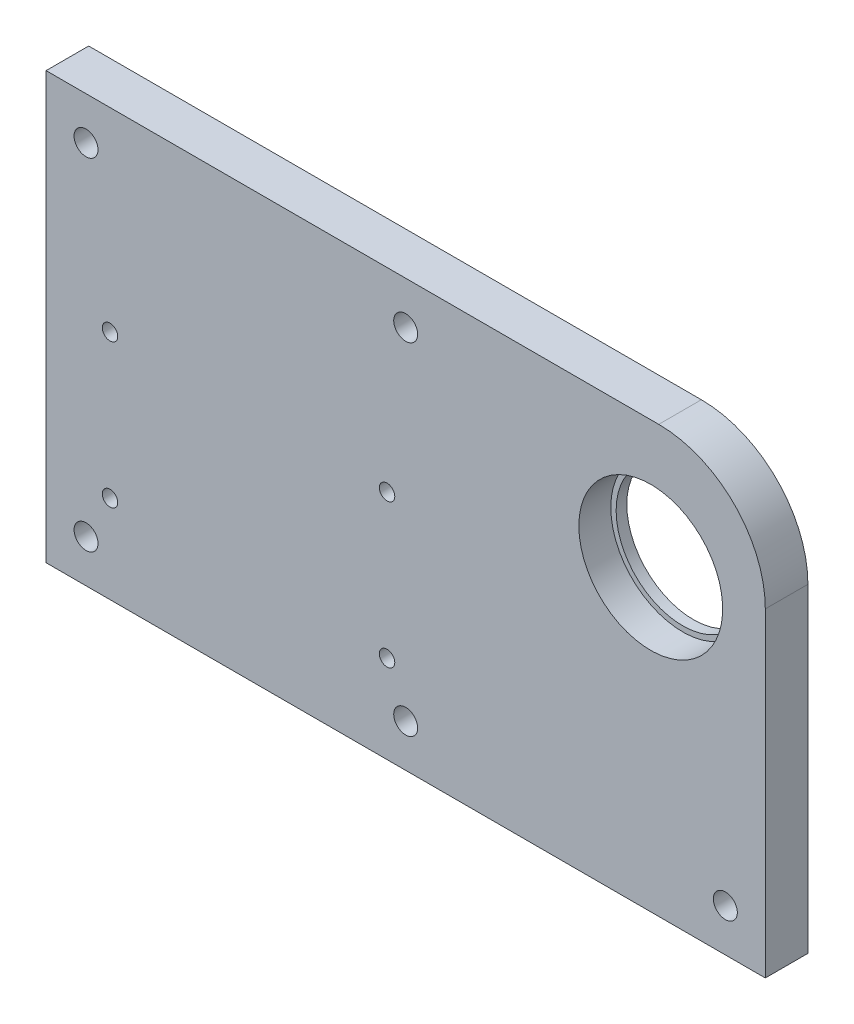
ISO-10303-21;
HEADER;
FILE_DESCRIPTION(('STEP AP214'),'2;1');
FILE_NAME('part.step','',(''),(''),'','','');
FILE_SCHEMA(('AUTOMOTIVE_DESIGN { 1 0 10303 214 1 1 1 1 }'));
ENDSEC;
DATA;
#1=APPLICATION_CONTEXT('core data for automotive mechanical design processes');
#2=APPLICATION_PROTOCOL_DEFINITION('international standard','automotive_design',2000,#1);
#3=PRODUCT_CONTEXT('',#1,'mechanical');
#4=PRODUCT('Part','Part','',(#3));
#5=PRODUCT_RELATED_PRODUCT_CATEGORY('part','',(#4));
#6=PRODUCT_DEFINITION_FORMATION('','',#4);
#7=PRODUCT_DEFINITION_CONTEXT('part definition',#1,'design');
#8=PRODUCT_DEFINITION('design','',#6,#7);
#9=PRODUCT_DEFINITION_SHAPE('','',#8);
#10=(LENGTH_UNIT() NAMED_UNIT(*) SI_UNIT(.MILLI.,.METRE.));
#11=(NAMED_UNIT(*) PLANE_ANGLE_UNIT() SI_UNIT($,.RADIAN.));
#12=(NAMED_UNIT(*) SI_UNIT($,.STERADIAN.) SOLID_ANGLE_UNIT());
#13=UNCERTAINTY_MEASURE_WITH_UNIT(LENGTH_MEASURE(1.E-05),#10,'distance_accuracy_value','');
#14=(GEOMETRIC_REPRESENTATION_CONTEXT(3) GLOBAL_UNCERTAINTY_ASSIGNED_CONTEXT((#13)) GLOBAL_UNIT_ASSIGNED_CONTEXT((#10,
#11,#12)) REPRESENTATION_CONTEXT('',''));
#15=CARTESIAN_POINT('',(0.,0.,0.));
#16=DIRECTION('',(0.,0.,1.));
#17=DIRECTION('',(1.,0.,0.));
#18=AXIS2_PLACEMENT_3D('',#15,#16,#17);
#19=CARTESIAN_POINT('',(-53.5,50.,8.));
#20=DIRECTION('',(1.,0.,0.));
#21=DIRECTION('',(0.,1.,0.));
#22=AXIS2_PLACEMENT_3D('',#19,#20,#21);
#23=PLANE('',#22);
#24=DIRECTION('',(0.,-1.,0.));
#25=VECTOR('',#24,1.);
#26=CARTESIAN_POINT('',(-53.5,50.,0.));
#27=LINE('',#26,#25);
#28=CARTESIAN_POINT('',(-53.5,50.,0.));
#29=VERTEX_POINT('',#28);
#30=CARTESIAN_POINT('',(-53.5,-30.,0.));
#31=VERTEX_POINT('',#30);
#32=EDGE_CURVE('E112',#29,#31,#27,.T.);
#33=ORIENTED_EDGE('',*,*,#32,.T.);
#34=DIRECTION('',(0.,0.,-1.));
#35=VECTOR('',#34,1.);
#36=CARTESIAN_POINT('',(-53.5,-30.,8.));
#37=LINE('',#36,#35);
#38=CARTESIAN_POINT('',(-53.5,-30.,8.));
#39=VERTEX_POINT('',#38);
#40=EDGE_CURVE('E92',#39,#31,#37,.T.);
#41=ORIENTED_EDGE('',*,*,#40,.F.);
#42=DIRECTION('',(0.,-1.,0.));
#43=VECTOR('',#42,1.);
#44=CARTESIAN_POINT('',(-53.5,50.,8.));
#45=LINE('',#44,#43);
#46=CARTESIAN_POINT('',(-53.5,50.,8.));
#47=VERTEX_POINT('',#46);
#48=EDGE_CURVE('E99',#47,#39,#45,.T.);
#49=ORIENTED_EDGE('',*,*,#48,.F.);
#50=DIRECTION('',(0.,0.,-1.));
#51=VECTOR('',#50,1.);
#52=CARTESIAN_POINT('',(-53.5,50.,8.));
#53=LINE('',#52,#51);
#54=EDGE_CURVE('E120',#47,#29,#53,.T.);
#55=ORIENTED_EDGE('',*,*,#54,.T.);
#56=EDGE_LOOP('',(#33,#41,#49,#55));
#57=FACE_BOUND('',#56,.T.);
#58=ADVANCED_FACE('F40',(#57),#23,.F.);
#59=CARTESIAN_POINT('',(-53.5,-30.,8.));
#60=DIRECTION('',(0.,1.,0.));
#61=DIRECTION('',(-1.,0.,0.));
#62=AXIS2_PLACEMENT_3D('',#59,#60,#61);
#63=PLANE('',#62);
#64=DIRECTION('',(1.,0.,0.));
#65=VECTOR('',#64,1.);
#66=CARTESIAN_POINT('',(-53.5,-30.,0.));
#67=LINE('',#66,#65);
#68=CARTESIAN_POINT('',(81.5,-30.,0.));
#69=VERTEX_POINT('',#68);
#70=EDGE_CURVE('E133',#31,#69,#67,.T.);
#71=ORIENTED_EDGE('',*,*,#70,.T.);
#72=DIRECTION('',(0.,0.,-1.));
#73=VECTOR('',#72,1.);
#74=CARTESIAN_POINT('',(81.5,-30.,8.));
#75=LINE('',#74,#73);
#76=CARTESIAN_POINT('',(81.5,-30.,8.));
#77=VERTEX_POINT('',#76);
#78=EDGE_CURVE('E95',#77,#69,#75,.T.);
#79=ORIENTED_EDGE('',*,*,#78,.F.);
#80=DIRECTION('',(1.,0.,0.));
#81=VECTOR('',#80,1.);
#82=CARTESIAN_POINT('',(-53.5,-30.,8.));
#83=LINE('',#82,#81);
#84=EDGE_CURVE('E88',#39,#77,#83,.T.);
#85=ORIENTED_EDGE('',*,*,#84,.F.);
#86=ORIENTED_EDGE('',*,*,#40,.T.);
#87=EDGE_LOOP('',(#71,#79,#85,#86));
#88=FACE_BOUND('',#87,.T.);
#89=ADVANCED_FACE('F90',(#88),#63,.F.);
#90=CARTESIAN_POINT('',(81.5,50.,8.));
#91=DIRECTION('',(-1.,0.,0.));
#92=DIRECTION('',(0.,-1.,0.));
#93=AXIS2_PLACEMENT_3D('',#90,#91,#92);
#94=PLANE('',#93);
#95=DIRECTION('',(0.,1.,0.));
#96=VECTOR('',#95,1.);
#97=CARTESIAN_POINT('',(81.5,50.,0.));
#98=LINE('',#97,#96);
#99=CARTESIAN_POINT('',(81.5,30.,0.));
#100=VERTEX_POINT('',#99);
#101=EDGE_CURVE('E130',#69,#100,#98,.T.);
#102=ORIENTED_EDGE('',*,*,#101,.T.);
#103=DIRECTION('',(0.,0.,-1.));
#104=VECTOR('',#103,1.);
#105=CARTESIAN_POINT('',(81.5,30.,8.));
#106=LINE('',#105,#104);
#107=CARTESIAN_POINT('',(81.5,30.,8.));
#108=VERTEX_POINT('',#107);
#109=EDGE_CURVE('E49',#100,#108,#106,.F.);
#110=ORIENTED_EDGE('',*,*,#109,.T.);
#111=DIRECTION('',(0.,1.,0.));
#112=VECTOR('',#111,1.);
#113=CARTESIAN_POINT('',(81.5,50.,8.));
#114=LINE('',#113,#112);
#115=EDGE_CURVE('E98',#77,#108,#114,.T.);
#116=ORIENTED_EDGE('',*,*,#115,.F.);
#117=ORIENTED_EDGE('',*,*,#78,.T.);
#118=EDGE_LOOP('',(#102,#110,#116,#117));
#119=FACE_BOUND('',#118,.T.);
#120=ADVANCED_FACE('F368',(#119),#94,.F.);
#121=CARTESIAN_POINT('',(-53.5,50.,8.));
#122=DIRECTION('',(0.,-1.,0.));
#123=DIRECTION('',(0.,0.,-1.));
#124=AXIS2_PLACEMENT_3D('',#121,#122,#123);
#125=PLANE('',#124);
#126=DIRECTION('',(-1.,0.,0.));
#127=VECTOR('',#126,1.);
#128=CARTESIAN_POINT('',(-53.5,50.,8.));
#129=LINE('',#128,#127);
#130=CARTESIAN_POINT('',(61.5,50.,8.));
#131=VERTEX_POINT('',#130);
#132=EDGE_CURVE('E104',#131,#47,#129,.T.);
#133=ORIENTED_EDGE('',*,*,#132,.F.);
#134=DIRECTION('',(0.,0.,-1.));
#135=VECTOR('',#134,1.);
#136=CARTESIAN_POINT('',(61.5,50.,8.));
#137=LINE('',#136,#135);
#138=CARTESIAN_POINT('',(61.5,50.,0.));
#139=VERTEX_POINT('',#138);
#140=EDGE_CURVE('E114',#131,#139,#137,.T.);
#141=ORIENTED_EDGE('',*,*,#140,.T.);
#142=DIRECTION('',(-1.,0.,0.));
#143=VECTOR('',#142,1.);
#144=CARTESIAN_POINT('',(-53.5,50.,0.));
#145=LINE('',#144,#143);
#146=EDGE_CURVE('E109',#139,#29,#145,.T.);
#147=ORIENTED_EDGE('',*,*,#146,.T.);
#148=ORIENTED_EDGE('',*,*,#54,.F.);
#149=EDGE_LOOP('',(#133,#141,#147,#148));
#150=FACE_BOUND('',#149,.T.);
#151=ADVANCED_FACE('F364',(#150),#125,.F.);
#152=CARTESIAN_POINT('',(0.,0.,8.));
#153=DIRECTION('',(0.,0.,1.));
#154=DIRECTION('',(1.,0.,0.));
#155=AXIS2_PLACEMENT_3D('',#152,#153,#154);
#156=PLANE('',#155);
#157=CARTESIAN_POINT('',(-46.,-22.,8.));
#158=DIRECTION('',(0.,0.,-1.));
#159=DIRECTION('',(-1.,0.,0.));
#160=AXIS2_PLACEMENT_3D('',#157,#158,#159);
#161=CIRCLE('',#160,2.25);
#162=CARTESIAN_POINT('',(-48.25,-22.,8.));
#163=VERTEX_POINT('',#162);
#164=EDGE_CURVE('E318',#163,#163,#161,.T.);
#165=ORIENTED_EDGE('',*,*,#164,.T.);
#166=EDGE_LOOP('',(#165));
#167=FACE_BOUND('',#166,.T.);
#168=CARTESIAN_POINT('',(14.,-22.,8.));
#169=DIRECTION('',(0.,0.,-1.));
#170=DIRECTION('',(-1.,0.,0.));
#171=AXIS2_PLACEMENT_3D('',#168,#169,#170);
#172=CIRCLE('',#171,2.25000000000001);
#173=CARTESIAN_POINT('',(11.75,-22.,8.));
#174=VERTEX_POINT('',#173);
#175=EDGE_CURVE('E298',#174,#174,#172,.T.);
#176=ORIENTED_EDGE('',*,*,#175,.T.);
#177=EDGE_LOOP('',(#176));
#178=FACE_BOUND('',#177,.T.);
#179=CARTESIAN_POINT('',(74.,-22.,8.));
#180=DIRECTION('',(0.,0.,-1.));
#181=DIRECTION('',(-1.,0.,0.));
#182=AXIS2_PLACEMENT_3D('',#179,#180,#181);
#183=CIRCLE('',#182,2.25);
#184=CARTESIAN_POINT('',(71.75,-22.,8.));
#185=VERTEX_POINT('',#184);
#186=EDGE_CURVE('E278',#185,#185,#183,.T.);
#187=ORIENTED_EDGE('',*,*,#186,.T.);
#188=EDGE_LOOP('',(#187));
#189=FACE_BOUND('',#188,.T.);
#190=CARTESIAN_POINT('',(-46.,42.,8.));
#191=DIRECTION('',(0.,0.,-1.));
#192=DIRECTION('',(-1.,0.,0.));
#193=AXIS2_PLACEMENT_3D('',#190,#191,#192);
#194=CIRCLE('',#193,2.25);
#195=CARTESIAN_POINT('',(-48.25,42.,8.));
#196=VERTEX_POINT('',#195);
#197=EDGE_CURVE('E258',#196,#196,#194,.T.);
#198=ORIENTED_EDGE('',*,*,#197,.T.);
#199=EDGE_LOOP('',(#198));
#200=FACE_BOUND('',#199,.T.);
#201=CARTESIAN_POINT('',(14.,42.,8.));
#202=DIRECTION('',(0.,0.,-1.));
#203=DIRECTION('',(-1.,0.,0.));
#204=AXIS2_PLACEMENT_3D('',#201,#202,#203);
#205=CIRCLE('',#204,2.25000000000001);
#206=CARTESIAN_POINT('',(11.75,42.,8.));
#207=VERTEX_POINT('',#206);
#208=EDGE_CURVE('E238',#207,#207,#205,.T.);
#209=ORIENTED_EDGE('',*,*,#208,.T.);
#210=EDGE_LOOP('',(#209));
#211=FACE_BOUND('',#210,.T.);
#212=CARTESIAN_POINT('',(60.,26.,8.));
#213=DIRECTION('',(0.,0.,-1.));
#214=DIRECTION('',(-1.,0.,0.));
#215=AXIS2_PLACEMENT_3D('',#212,#213,#214);
#216=CIRCLE('',#215,13.5);
#217=CARTESIAN_POINT('',(46.5,26.,8.));
#218=VERTEX_POINT('',#217);
#219=EDGE_CURVE('E226',#218,#218,#216,.T.);
#220=ORIENTED_EDGE('',*,*,#219,.T.);
#221=EDGE_LOOP('',(#220));
#222=FACE_BOUND('',#221,.T.);
#223=CARTESIAN_POINT('',(10.5,13.5,8.));
#224=DIRECTION('',(0.,0.,-1.));
#225=DIRECTION('',(-1.,0.,0.));
#226=AXIS2_PLACEMENT_3D('',#223,#224,#225);
#227=CIRCLE('',#226,1.45);
#228=CARTESIAN_POINT('',(9.05,13.5,8.));
#229=VERTEX_POINT('',#228);
#230=EDGE_CURVE('E202',#229,#229,#227,.T.);
#231=ORIENTED_EDGE('',*,*,#230,.T.);
#232=EDGE_LOOP('',(#231));
#233=FACE_BOUND('',#232,.T.);
#234=CARTESIAN_POINT('',(10.5,-13.5,8.));
#235=DIRECTION('',(0.,0.,-1.));
#236=DIRECTION('',(-1.,0.,0.));
#237=AXIS2_PLACEMENT_3D('',#234,#235,#236);
#238=CIRCLE('',#237,1.45);
#239=CARTESIAN_POINT('',(9.05,-13.5,8.));
#240=VERTEX_POINT('',#239);
#241=EDGE_CURVE('E182',#240,#240,#238,.T.);
#242=ORIENTED_EDGE('',*,*,#241,.T.);
#243=EDGE_LOOP('',(#242));
#244=FACE_BOUND('',#243,.T.);
#245=CARTESIAN_POINT('',(-41.5,-13.5,8.));
#246=DIRECTION('',(0.,0.,-1.));
#247=DIRECTION('',(-1.,0.,0.));
#248=AXIS2_PLACEMENT_3D('',#245,#246,#247);
#249=CIRCLE('',#248,1.45);
#250=CARTESIAN_POINT('',(-42.95,-13.5,8.));
#251=VERTEX_POINT('',#250);
#252=EDGE_CURVE('E162',#251,#251,#249,.T.);
#253=ORIENTED_EDGE('',*,*,#252,.T.);
#254=EDGE_LOOP('',(#253));
#255=FACE_BOUND('',#254,.T.);
#256=CARTESIAN_POINT('',(-41.5,13.5,8.));
#257=DIRECTION('',(0.,0.,-1.));
#258=DIRECTION('',(-1.,0.,0.));
#259=AXIS2_PLACEMENT_3D('',#256,#257,#258);
#260=CIRCLE('',#259,1.45);
#261=CARTESIAN_POINT('',(-42.95,13.5,8.));
#262=VERTEX_POINT('',#261);
#263=EDGE_CURVE('E138',#262,#262,#260,.T.);
#264=ORIENTED_EDGE('',*,*,#263,.T.);
#265=EDGE_LOOP('',(#264));
#266=FACE_BOUND('',#265,.T.);
#267=ORIENTED_EDGE('',*,*,#115,.T.);
#268=CARTESIAN_POINT('',(61.5,30.,8.));
#269=DIRECTION('',(0.,0.,1.));
#270=DIRECTION('',(1.,0.,0.));
#271=AXIS2_PLACEMENT_3D('',#268,#269,#270);
#272=CIRCLE('',#271,20.);
#273=EDGE_CURVE('E11',#108,#131,#272,.T.);
#274=ORIENTED_EDGE('',*,*,#273,.T.);
#275=ORIENTED_EDGE('',*,*,#132,.T.);
#276=ORIENTED_EDGE('',*,*,#48,.T.);
#277=ORIENTED_EDGE('',*,*,#84,.T.);
#278=EDGE_LOOP('',(#267,#274,#275,#276,#277));
#279=FACE_BOUND('',#278,.T.);
#280=ADVANCED_FACE('F102',(#167,#178,#189,#200,#211,#222,#233,#244,#255,#266,#279),#156,.T.);
#281=CARTESIAN_POINT('',(0.,0.,0.));
#282=DIRECTION('',(0.,0.,1.));
#283=DIRECTION('',(1.,0.,0.));
#284=AXIS2_PLACEMENT_3D('',#281,#282,#283);
#285=PLANE('',#284);
#286=CARTESIAN_POINT('',(-46.,-22.,0.));
#287=DIRECTION('',(0.,0.,-1.));
#288=DIRECTION('',(-1.,0.,0.));
#289=AXIS2_PLACEMENT_3D('',#286,#287,#288);
#290=CIRCLE('',#289,4.025);
#291=CARTESIAN_POINT('',(-50.025,-22.,0.));
#292=VERTEX_POINT('',#291);
#293=EDGE_CURVE('E334',#292,#292,#290,.T.);
#294=ORIENTED_EDGE('',*,*,#293,.F.);
#295=EDGE_LOOP('',(#294));
#296=FACE_BOUND('',#295,.T.);
#297=CARTESIAN_POINT('',(14.,-22.,0.));
#298=DIRECTION('',(0.,0.,-1.));
#299=DIRECTION('',(-1.,0.,0.));
#300=AXIS2_PLACEMENT_3D('',#297,#298,#299);
#301=CIRCLE('',#300,4.025);
#302=CARTESIAN_POINT('',(9.97500000000001,-22.,0.));
#303=VERTEX_POINT('',#302);
#304=EDGE_CURVE('E314',#303,#303,#301,.T.);
#305=ORIENTED_EDGE('',*,*,#304,.F.);
#306=EDGE_LOOP('',(#305));
#307=FACE_BOUND('',#306,.T.);
#308=CARTESIAN_POINT('',(74.,-22.,0.));
#309=DIRECTION('',(0.,0.,-1.));
#310=DIRECTION('',(-1.,0.,0.));
#311=AXIS2_PLACEMENT_3D('',#308,#309,#310);
#312=CIRCLE('',#311,4.025);
#313=CARTESIAN_POINT('',(69.975,-22.,0.));
#314=VERTEX_POINT('',#313);
#315=EDGE_CURVE('E294',#314,#314,#312,.T.);
#316=ORIENTED_EDGE('',*,*,#315,.F.);
#317=EDGE_LOOP('',(#316));
#318=FACE_BOUND('',#317,.T.);
#319=CARTESIAN_POINT('',(-46.,42.,0.));
#320=DIRECTION('',(0.,0.,-1.));
#321=DIRECTION('',(-1.,0.,0.));
#322=AXIS2_PLACEMENT_3D('',#319,#320,#321);
#323=CIRCLE('',#322,4.025);
#324=CARTESIAN_POINT('',(-50.025,42.,0.));
#325=VERTEX_POINT('',#324);
#326=EDGE_CURVE('E274',#325,#325,#323,.T.);
#327=ORIENTED_EDGE('',*,*,#326,.F.);
#328=EDGE_LOOP('',(#327));
#329=FACE_BOUND('',#328,.T.);
#330=CARTESIAN_POINT('',(14.,42.,0.));
#331=DIRECTION('',(0.,0.,-1.));
#332=DIRECTION('',(-1.,0.,0.));
#333=AXIS2_PLACEMENT_3D('',#330,#331,#332);
#334=CIRCLE('',#333,4.025);
#335=CARTESIAN_POINT('',(9.975,42.,0.));
#336=VERTEX_POINT('',#335);
#337=EDGE_CURVE('E254',#336,#336,#334,.T.);
#338=ORIENTED_EDGE('',*,*,#337,.F.);
#339=EDGE_LOOP('',(#338));
#340=FACE_BOUND('',#339,.T.);
#341=CARTESIAN_POINT('',(60.,26.,0.));
#342=DIRECTION('',(0.,0.,-1.));
#343=DIRECTION('',(-1.,0.,0.));
#344=AXIS2_PLACEMENT_3D('',#341,#342,#343);
#345=CIRCLE('',#344,12.5);
#346=CARTESIAN_POINT('',(47.5,26.,0.));
#347=VERTEX_POINT('',#346);
#348=EDGE_CURVE('E230',#347,#347,#345,.T.);
#349=ORIENTED_EDGE('',*,*,#348,.F.);
#350=EDGE_LOOP('',(#349));
#351=FACE_BOUND('',#350,.T.);
#352=CARTESIAN_POINT('',(10.5,13.5,0.));
#353=DIRECTION('',(0.,0.,-1.));
#354=DIRECTION('',(-1.,0.,0.));
#355=AXIS2_PLACEMENT_3D('',#352,#353,#354);
#356=CIRCLE('',#355,2.775);
#357=CARTESIAN_POINT('',(7.725,13.5,0.));
#358=VERTEX_POINT('',#357);
#359=EDGE_CURVE('E218',#358,#358,#356,.T.);
#360=ORIENTED_EDGE('',*,*,#359,.F.);
#361=EDGE_LOOP('',(#360));
#362=FACE_BOUND('',#361,.T.);
#363=CARTESIAN_POINT('',(10.5,-13.5,0.));
#364=DIRECTION('',(0.,0.,-1.));
#365=DIRECTION('',(-1.,0.,0.));
#366=AXIS2_PLACEMENT_3D('',#363,#364,#365);
#367=CIRCLE('',#366,2.775);
#368=CARTESIAN_POINT('',(7.725,-13.5,0.));
#369=VERTEX_POINT('',#368);
#370=EDGE_CURVE('E198',#369,#369,#367,.T.);
#371=ORIENTED_EDGE('',*,*,#370,.F.);
#372=EDGE_LOOP('',(#371));
#373=FACE_BOUND('',#372,.T.);
#374=CARTESIAN_POINT('',(-41.5,-13.5,0.));
#375=DIRECTION('',(0.,0.,-1.));
#376=DIRECTION('',(-1.,0.,0.));
#377=AXIS2_PLACEMENT_3D('',#374,#375,#376);
#378=CIRCLE('',#377,2.775);
#379=CARTESIAN_POINT('',(-44.275,-13.5,0.));
#380=VERTEX_POINT('',#379);
#381=EDGE_CURVE('E178',#380,#380,#378,.T.);
#382=ORIENTED_EDGE('',*,*,#381,.F.);
#383=EDGE_LOOP('',(#382));
#384=FACE_BOUND('',#383,.T.);
#385=CARTESIAN_POINT('',(-41.5,13.5,0.));
#386=DIRECTION('',(0.,0.,-1.));
#387=DIRECTION('',(-1.,0.,0.));
#388=AXIS2_PLACEMENT_3D('',#385,#386,#387);
#389=CIRCLE('',#388,2.775);
#390=CARTESIAN_POINT('',(-44.275,13.5,0.));
#391=VERTEX_POINT('',#390);
#392=EDGE_CURVE('E158',#391,#391,#389,.T.);
#393=ORIENTED_EDGE('',*,*,#392,.F.);
#394=EDGE_LOOP('',(#393));
#395=FACE_BOUND('',#394,.T.);
#396=ORIENTED_EDGE('',*,*,#146,.F.);
#397=CARTESIAN_POINT('',(61.5,30.,0.));
#398=DIRECTION('',(0.,0.,1.));
#399=DIRECTION('',(1.,0.,0.));
#400=AXIS2_PLACEMENT_3D('',#397,#398,#399);
#401=CIRCLE('',#400,20.);
#402=EDGE_CURVE('E63',#139,#100,#401,.F.);
#403=ORIENTED_EDGE('',*,*,#402,.T.);
#404=ORIENTED_EDGE('',*,*,#101,.F.);
#405=ORIENTED_EDGE('',*,*,#70,.F.);
#406=ORIENTED_EDGE('',*,*,#32,.F.);
#407=EDGE_LOOP('',(#396,#403,#404,#405,#406));
#408=FACE_BOUND('',#407,.T.);
#409=ADVANCED_FACE('F341',(#296,#307,#318,#329,#340,#351,#362,#373,#384,#395,#408),#285,.F.);
#410=CARTESIAN_POINT('',(-41.5,13.5,0.));
#411=DIRECTION('',(0.,0.,-1.));
#412=DIRECTION('',(-1.,0.,0.));
#413=AXIS2_PLACEMENT_3D('',#410,#411,#412);
#414=CYLINDRICAL_SURFACE('',#413,1.45000000000001);
#415=ORIENTED_EDGE('',*,*,#263,.F.);
#416=EDGE_LOOP('',(#415));
#417=FACE_BOUND('',#416,.T.);
#418=CARTESIAN_POINT('',(-41.5,13.5,2.5));
#419=DIRECTION('',(0.,0.,-1.));
#420=DIRECTION('',(-1.,0.,0.));
#421=AXIS2_PLACEMENT_3D('',#418,#419,#420);
#422=CIRCLE('',#421,1.45000000000001);
#423=CARTESIAN_POINT('',(-42.95,13.5,2.5));
#424=VERTEX_POINT('',#423);
#425=EDGE_CURVE('E146',#424,#424,#422,.T.);
#426=ORIENTED_EDGE('',*,*,#425,.T.);
#427=EDGE_LOOP('',(#426));
#428=FACE_BOUND('',#427,.T.);
#429=ADVANCED_FACE('F344',(#417,#428),#414,.F.);
#430=CARTESIAN_POINT('',(-38.75,13.5,2.5));
#431=DIRECTION('',(0.,0.,1.));
#432=DIRECTION('',(1.,0.,0.));
#433=AXIS2_PLACEMENT_3D('',#430,#431,#432);
#434=PLANE('',#433);
#435=ORIENTED_EDGE('',*,*,#425,.F.);
#436=EDGE_LOOP('',(#435));
#437=FACE_BOUND('',#436,.T.);
#438=CARTESIAN_POINT('',(-41.5,13.5,2.5));
#439=DIRECTION('',(0.,0.,-1.));
#440=DIRECTION('',(-1.,0.,0.));
#441=AXIS2_PLACEMENT_3D('',#438,#439,#440);
#442=CIRCLE('',#441,2.75);
#443=CARTESIAN_POINT('',(-44.25,13.5,2.5));
#444=VERTEX_POINT('',#443);
#445=EDGE_CURVE('E150',#444,#444,#442,.T.);
#446=ORIENTED_EDGE('',*,*,#445,.T.);
#447=EDGE_LOOP('',(#446));
#448=FACE_BOUND('',#447,.T.);
#449=ADVANCED_FACE('F394',(#437,#448),#434,.F.);
#450=CARTESIAN_POINT('',(-41.5,13.5,0.));
#451=DIRECTION('',(0.,0.,-1.));
#452=DIRECTION('',(-1.,0.,0.));
#453=AXIS2_PLACEMENT_3D('',#450,#451,#452);
#454=CYLINDRICAL_SURFACE('',#453,2.75);
#455=ORIENTED_EDGE('',*,*,#445,.F.);
#456=EDGE_LOOP('',(#455));
#457=FACE_BOUND('',#456,.T.);
#458=CARTESIAN_POINT('',(-41.5,13.5,0.0250000000000012));
#459=DIRECTION('',(0.,0.,-1.));
#460=DIRECTION('',(-1.,0.,0.));
#461=AXIS2_PLACEMENT_3D('',#458,#459,#460);
#462=CIRCLE('',#461,2.75);
#463=CARTESIAN_POINT('',(-44.25,13.5,0.0250000000000012));
#464=VERTEX_POINT('',#463);
#465=EDGE_CURVE('E154',#464,#464,#462,.T.);
#466=ORIENTED_EDGE('',*,*,#465,.T.);
#467=EDGE_LOOP('',(#466));
#468=FACE_BOUND('',#467,.T.);
#469=ADVANCED_FACE('F405',(#457,#468),#454,.F.);
#470=CARTESIAN_POINT('',(-41.5,13.5,0.));
#471=DIRECTION('',(0.,0.,-1.));
#472=DIRECTION('',(-1.,0.,0.));
#473=AXIS2_PLACEMENT_3D('',#470,#471,#472);
#474=CONICAL_SURFACE('',#473,2.775,0.7853981633973);
#475=ORIENTED_EDGE('',*,*,#465,.F.);
#476=EDGE_LOOP('',(#475));
#477=FACE_BOUND('',#476,.T.);
#478=ORIENTED_EDGE('',*,*,#392,.T.);
#479=EDGE_LOOP('',(#478));
#480=FACE_BOUND('',#479,.T.);
#481=ADVANCED_FACE('F415',(#477,#480),#474,.F.);
#482=CARTESIAN_POINT('',(-41.5,-13.5,0.));
#483=DIRECTION('',(0.,0.,-1.));
#484=DIRECTION('',(-1.,0.,0.));
#485=AXIS2_PLACEMENT_3D('',#482,#483,#484);
#486=CYLINDRICAL_SURFACE('',#485,1.45000000000001);
#487=ORIENTED_EDGE('',*,*,#252,.F.);
#488=EDGE_LOOP('',(#487));
#489=FACE_BOUND('',#488,.T.);
#490=CARTESIAN_POINT('',(-41.5,-13.5,2.5));
#491=DIRECTION('',(0.,0.,-1.));
#492=DIRECTION('',(-1.,0.,0.));
#493=AXIS2_PLACEMENT_3D('',#490,#491,#492);
#494=CIRCLE('',#493,1.45000000000001);
#495=CARTESIAN_POINT('',(-42.95,-13.5,2.5));
#496=VERTEX_POINT('',#495);
#497=EDGE_CURVE('E166',#496,#496,#494,.T.);
#498=ORIENTED_EDGE('',*,*,#497,.T.);
#499=EDGE_LOOP('',(#498));
#500=FACE_BOUND('',#499,.T.);
#501=ADVANCED_FACE('F425',(#489,#500),#486,.F.);
#502=CARTESIAN_POINT('',(-38.75,-13.5,2.5));
#503=DIRECTION('',(0.,0.,1.));
#504=DIRECTION('',(1.,0.,0.));
#505=AXIS2_PLACEMENT_3D('',#502,#503,#504);
#506=PLANE('',#505);
#507=ORIENTED_EDGE('',*,*,#497,.F.);
#508=EDGE_LOOP('',(#507));
#509=FACE_BOUND('',#508,.T.);
#510=CARTESIAN_POINT('',(-41.5,-13.5,2.5));
#511=DIRECTION('',(0.,0.,-1.));
#512=DIRECTION('',(-1.,0.,0.));
#513=AXIS2_PLACEMENT_3D('',#510,#511,#512);
#514=CIRCLE('',#513,2.75);
#515=CARTESIAN_POINT('',(-44.25,-13.5,2.5));
#516=VERTEX_POINT('',#515);
#517=EDGE_CURVE('E170',#516,#516,#514,.T.);
#518=ORIENTED_EDGE('',*,*,#517,.T.);
#519=EDGE_LOOP('',(#518));
#520=FACE_BOUND('',#519,.T.);
#521=ADVANCED_FACE('F435',(#509,#520),#506,.F.);
#522=CARTESIAN_POINT('',(-41.5,-13.5,0.));
#523=DIRECTION('',(0.,0.,-1.));
#524=DIRECTION('',(-1.,0.,0.));
#525=AXIS2_PLACEMENT_3D('',#522,#523,#524);
#526=CYLINDRICAL_SURFACE('',#525,2.75);
#527=ORIENTED_EDGE('',*,*,#517,.F.);
#528=EDGE_LOOP('',(#527));
#529=FACE_BOUND('',#528,.T.);
#530=CARTESIAN_POINT('',(-41.5,-13.5,0.0250000000000012));
#531=DIRECTION('',(0.,0.,-1.));
#532=DIRECTION('',(-1.,0.,0.));
#533=AXIS2_PLACEMENT_3D('',#530,#531,#532);
#534=CIRCLE('',#533,2.75);
#535=CARTESIAN_POINT('',(-44.25,-13.5,0.0250000000000012));
#536=VERTEX_POINT('',#535);
#537=EDGE_CURVE('E174',#536,#536,#534,.T.);
#538=ORIENTED_EDGE('',*,*,#537,.T.);
#539=EDGE_LOOP('',(#538));
#540=FACE_BOUND('',#539,.T.);
#541=ADVANCED_FACE('F445',(#529,#540),#526,.F.);
#542=CARTESIAN_POINT('',(-41.5,-13.5,0.));
#543=DIRECTION('',(0.,0.,-1.));
#544=DIRECTION('',(-1.,0.,0.));
#545=AXIS2_PLACEMENT_3D('',#542,#543,#544);
#546=CONICAL_SURFACE('',#545,2.775,0.7853981633973);
#547=ORIENTED_EDGE('',*,*,#537,.F.);
#548=EDGE_LOOP('',(#547));
#549=FACE_BOUND('',#548,.T.);
#550=ORIENTED_EDGE('',*,*,#381,.T.);
#551=EDGE_LOOP('',(#550));
#552=FACE_BOUND('',#551,.T.);
#553=ADVANCED_FACE('F455',(#549,#552),#546,.F.);
#554=CARTESIAN_POINT('',(10.5,-13.5,0.));
#555=DIRECTION('',(0.,0.,-1.));
#556=DIRECTION('',(-1.,0.,0.));
#557=AXIS2_PLACEMENT_3D('',#554,#555,#556);
#558=CYLINDRICAL_SURFACE('',#557,1.45000000000001);
#559=ORIENTED_EDGE('',*,*,#241,.F.);
#560=EDGE_LOOP('',(#559));
#561=FACE_BOUND('',#560,.T.);
#562=CARTESIAN_POINT('',(10.5,-13.5,2.5));
#563=DIRECTION('',(0.,0.,-1.));
#564=DIRECTION('',(-1.,0.,0.));
#565=AXIS2_PLACEMENT_3D('',#562,#563,#564);
#566=CIRCLE('',#565,1.45000000000001);
#567=CARTESIAN_POINT('',(9.04999999999999,-13.5,2.5));
#568=VERTEX_POINT('',#567);
#569=EDGE_CURVE('E186',#568,#568,#566,.T.);
#570=ORIENTED_EDGE('',*,*,#569,.T.);
#571=EDGE_LOOP('',(#570));
#572=FACE_BOUND('',#571,.T.);
#573=ADVANCED_FACE('F465',(#561,#572),#558,.F.);
#574=CARTESIAN_POINT('',(13.25,-13.5,2.5));
#575=DIRECTION('',(0.,0.,1.));
#576=DIRECTION('',(1.,0.,0.));
#577=AXIS2_PLACEMENT_3D('',#574,#575,#576);
#578=PLANE('',#577);
#579=ORIENTED_EDGE('',*,*,#569,.F.);
#580=EDGE_LOOP('',(#579));
#581=FACE_BOUND('',#580,.T.);
#582=CARTESIAN_POINT('',(10.5,-13.5,2.5));
#583=DIRECTION('',(0.,0.,-1.));
#584=DIRECTION('',(-1.,0.,0.));
#585=AXIS2_PLACEMENT_3D('',#582,#583,#584);
#586=CIRCLE('',#585,2.75);
#587=CARTESIAN_POINT('',(7.75000000000001,-13.5,2.5));
#588=VERTEX_POINT('',#587);
#589=EDGE_CURVE('E190',#588,#588,#586,.T.);
#590=ORIENTED_EDGE('',*,*,#589,.T.);
#591=EDGE_LOOP('',(#590));
#592=FACE_BOUND('',#591,.T.);
#593=ADVANCED_FACE('F475',(#581,#592),#578,.F.);
#594=CARTESIAN_POINT('',(10.5,-13.5,0.));
#595=DIRECTION('',(0.,0.,-1.));
#596=DIRECTION('',(-1.,0.,0.));
#597=AXIS2_PLACEMENT_3D('',#594,#595,#596);
#598=CYLINDRICAL_SURFACE('',#597,2.75);
#599=ORIENTED_EDGE('',*,*,#589,.F.);
#600=EDGE_LOOP('',(#599));
#601=FACE_BOUND('',#600,.T.);
#602=CARTESIAN_POINT('',(10.5,-13.5,0.0250000000000012));
#603=DIRECTION('',(0.,0.,-1.));
#604=DIRECTION('',(-1.,0.,0.));
#605=AXIS2_PLACEMENT_3D('',#602,#603,#604);
#606=CIRCLE('',#605,2.75);
#607=CARTESIAN_POINT('',(7.75,-13.5,0.0250000000000012));
#608=VERTEX_POINT('',#607);
#609=EDGE_CURVE('E194',#608,#608,#606,.T.);
#610=ORIENTED_EDGE('',*,*,#609,.T.);
#611=EDGE_LOOP('',(#610));
#612=FACE_BOUND('',#611,.T.);
#613=ADVANCED_FACE('F485',(#601,#612),#598,.F.);
#614=CARTESIAN_POINT('',(10.5,-13.5,0.));
#615=DIRECTION('',(0.,0.,-1.));
#616=DIRECTION('',(-1.,0.,0.));
#617=AXIS2_PLACEMENT_3D('',#614,#615,#616);
#618=CONICAL_SURFACE('',#617,2.775,0.785398163397369);
#619=ORIENTED_EDGE('',*,*,#609,.F.);
#620=EDGE_LOOP('',(#619));
#621=FACE_BOUND('',#620,.T.);
#622=ORIENTED_EDGE('',*,*,#370,.T.);
#623=EDGE_LOOP('',(#622));
#624=FACE_BOUND('',#623,.T.);
#625=ADVANCED_FACE('F495',(#621,#624),#618,.F.);
#626=CARTESIAN_POINT('',(10.5,13.5,0.));
#627=DIRECTION('',(0.,0.,-1.));
#628=DIRECTION('',(-1.,0.,0.));
#629=AXIS2_PLACEMENT_3D('',#626,#627,#628);
#630=CYLINDRICAL_SURFACE('',#629,1.45000000000001);
#631=ORIENTED_EDGE('',*,*,#230,.F.);
#632=EDGE_LOOP('',(#631));
#633=FACE_BOUND('',#632,.T.);
#634=CARTESIAN_POINT('',(10.5,13.5,2.5));
#635=DIRECTION('',(0.,0.,-1.));
#636=DIRECTION('',(-1.,0.,0.));
#637=AXIS2_PLACEMENT_3D('',#634,#635,#636);
#638=CIRCLE('',#637,1.45000000000001);
#639=CARTESIAN_POINT('',(9.04999999999999,13.5,2.5));
#640=VERTEX_POINT('',#639);
#641=EDGE_CURVE('E206',#640,#640,#638,.T.);
#642=ORIENTED_EDGE('',*,*,#641,.T.);
#643=EDGE_LOOP('',(#642));
#644=FACE_BOUND('',#643,.T.);
#645=ADVANCED_FACE('F505',(#633,#644),#630,.F.);
#646=CARTESIAN_POINT('',(13.25,13.5,2.5));
#647=DIRECTION('',(0.,0.,1.));
#648=DIRECTION('',(1.,0.,0.));
#649=AXIS2_PLACEMENT_3D('',#646,#647,#648);
#650=PLANE('',#649);
#651=ORIENTED_EDGE('',*,*,#641,.F.);
#652=EDGE_LOOP('',(#651));
#653=FACE_BOUND('',#652,.T.);
#654=CARTESIAN_POINT('',(10.5,13.5,2.5));
#655=DIRECTION('',(0.,0.,-1.));
#656=DIRECTION('',(-1.,0.,0.));
#657=AXIS2_PLACEMENT_3D('',#654,#655,#656);
#658=CIRCLE('',#657,2.75);
#659=CARTESIAN_POINT('',(7.75000000000001,13.5,2.5));
#660=VERTEX_POINT('',#659);
#661=EDGE_CURVE('E210',#660,#660,#658,.T.);
#662=ORIENTED_EDGE('',*,*,#661,.T.);
#663=EDGE_LOOP('',(#662));
#664=FACE_BOUND('',#663,.T.);
#665=ADVANCED_FACE('F515',(#653,#664),#650,.F.);
#666=CARTESIAN_POINT('',(10.5,13.5,0.));
#667=DIRECTION('',(0.,0.,-1.));
#668=DIRECTION('',(-1.,0.,0.));
#669=AXIS2_PLACEMENT_3D('',#666,#667,#668);
#670=CYLINDRICAL_SURFACE('',#669,2.75);
#671=ORIENTED_EDGE('',*,*,#661,.F.);
#672=EDGE_LOOP('',(#671));
#673=FACE_BOUND('',#672,.T.);
#674=CARTESIAN_POINT('',(10.5,13.5,0.0250000000000012));
#675=DIRECTION('',(0.,0.,-1.));
#676=DIRECTION('',(-1.,0.,0.));
#677=AXIS2_PLACEMENT_3D('',#674,#675,#676);
#678=CIRCLE('',#677,2.75);
#679=CARTESIAN_POINT('',(7.75,13.5,0.0250000000000012));
#680=VERTEX_POINT('',#679);
#681=EDGE_CURVE('E214',#680,#680,#678,.T.);
#682=ORIENTED_EDGE('',*,*,#681,.T.);
#683=EDGE_LOOP('',(#682));
#684=FACE_BOUND('',#683,.T.);
#685=ADVANCED_FACE('F525',(#673,#684),#670,.F.);
#686=CARTESIAN_POINT('',(10.5,13.5,0.));
#687=DIRECTION('',(0.,0.,-1.));
#688=DIRECTION('',(-1.,0.,0.));
#689=AXIS2_PLACEMENT_3D('',#686,#687,#688);
#690=CONICAL_SURFACE('',#689,2.775,0.785398163397369);
#691=ORIENTED_EDGE('',*,*,#681,.F.);
#692=EDGE_LOOP('',(#691));
#693=FACE_BOUND('',#692,.T.);
#694=ORIENTED_EDGE('',*,*,#359,.T.);
#695=EDGE_LOOP('',(#694));
#696=FACE_BOUND('',#695,.T.);
#697=ADVANCED_FACE('F535',(#693,#696),#690,.F.);
#698=CARTESIAN_POINT('',(60.,39.5,2.));
#699=DIRECTION('',(0.,0.,-1.));
#700=DIRECTION('',(-1.,0.,0.));
#701=AXIS2_PLACEMENT_3D('',#698,#699,#700);
#702=PLANE('',#701);
#703=CARTESIAN_POINT('',(60.,26.,2.));
#704=DIRECTION('',(0.,0.,-1.));
#705=DIRECTION('',(-1.,0.,0.));
#706=AXIS2_PLACEMENT_3D('',#703,#704,#705);
#707=CIRCLE('',#706,13.5);
#708=CARTESIAN_POINT('',(46.5,26.,2.));
#709=VERTEX_POINT('',#708);
#710=EDGE_CURVE('E222',#709,#709,#707,.T.);
#711=ORIENTED_EDGE('',*,*,#710,.F.);
#712=EDGE_LOOP('',(#711));
#713=FACE_BOUND('',#712,.T.);
#714=CARTESIAN_POINT('',(60.,26.,2.));
#715=DIRECTION('',(0.,0.,-1.));
#716=DIRECTION('',(-1.,0.,0.));
#717=AXIS2_PLACEMENT_3D('',#714,#715,#716);
#718=CIRCLE('',#717,12.5);
#719=CARTESIAN_POINT('',(47.5,26.,2.));
#720=VERTEX_POINT('',#719);
#721=EDGE_CURVE('E234',#720,#720,#718,.T.);
#722=ORIENTED_EDGE('',*,*,#721,.T.);
#723=EDGE_LOOP('',(#722));
#724=FACE_BOUND('',#723,.T.);
#725=ADVANCED_FACE('F545',(#713,#724),#702,.F.);
#726=CARTESIAN_POINT('',(60.,26.,0.));
#727=DIRECTION('',(0.,0.,-1.));
#728=DIRECTION('',(-1.,0.,0.));
#729=AXIS2_PLACEMENT_3D('',#726,#727,#728);
#730=CYLINDRICAL_SURFACE('',#729,13.5);
#731=ORIENTED_EDGE('',*,*,#219,.F.);
#732=EDGE_LOOP('',(#731));
#733=FACE_BOUND('',#732,.T.);
#734=ORIENTED_EDGE('',*,*,#710,.T.);
#735=EDGE_LOOP('',(#734));
#736=FACE_BOUND('',#735,.T.);
#737=ADVANCED_FACE('F555',(#733,#736),#730,.F.);
#738=CARTESIAN_POINT('',(60.,26.,0.));
#739=DIRECTION('',(0.,0.,-1.));
#740=DIRECTION('',(-1.,0.,0.));
#741=AXIS2_PLACEMENT_3D('',#738,#739,#740);
#742=CYLINDRICAL_SURFACE('',#741,12.5);
#743=ORIENTED_EDGE('',*,*,#721,.F.);
#744=EDGE_LOOP('',(#743));
#745=FACE_BOUND('',#744,.T.);
#746=ORIENTED_EDGE('',*,*,#348,.T.);
#747=EDGE_LOOP('',(#746));
#748=FACE_BOUND('',#747,.T.);
#749=ADVANCED_FACE('F565',(#745,#748),#742,.F.);
#750=CARTESIAN_POINT('',(14.,42.,0.));
#751=DIRECTION('',(0.,0.,-1.));
#752=DIRECTION('',(-1.,0.,0.));
#753=AXIS2_PLACEMENT_3D('',#750,#751,#752);
#754=CYLINDRICAL_SURFACE('',#753,2.25000000000001);
#755=ORIENTED_EDGE('',*,*,#208,.F.);
#756=EDGE_LOOP('',(#755));
#757=FACE_BOUND('',#756,.T.);
#758=CARTESIAN_POINT('',(14.,42.,3.99999999999999));
#759=DIRECTION('',(0.,0.,-1.));
#760=DIRECTION('',(-1.,0.,0.));
#761=AXIS2_PLACEMENT_3D('',#758,#759,#760);
#762=CIRCLE('',#761,2.25000000000001);
#763=CARTESIAN_POINT('',(11.75,42.,3.99999999999999));
#764=VERTEX_POINT('',#763);
#765=EDGE_CURVE('E242',#764,#764,#762,.T.);
#766=ORIENTED_EDGE('',*,*,#765,.T.);
#767=EDGE_LOOP('',(#766));
#768=FACE_BOUND('',#767,.T.);
#769=ADVANCED_FACE('F575',(#757,#768),#754,.F.);
#770=CARTESIAN_POINT('',(18.,42.,3.99999999999999));
#771=DIRECTION('',(0.,0.,1.));
#772=DIRECTION('',(1.,0.,0.));
#773=AXIS2_PLACEMENT_3D('',#770,#771,#772);
#774=PLANE('',#773);
#775=ORIENTED_EDGE('',*,*,#765,.F.);
#776=EDGE_LOOP('',(#775));
#777=FACE_BOUND('',#776,.T.);
#778=CARTESIAN_POINT('',(14.,42.,3.99999999999999));
#779=DIRECTION('',(0.,0.,-1.));
#780=DIRECTION('',(-1.,0.,0.));
#781=AXIS2_PLACEMENT_3D('',#778,#779,#780);
#782=CIRCLE('',#781,3.99999999999999);
#783=CARTESIAN_POINT('',(10.,42.,3.99999999999999));
#784=VERTEX_POINT('',#783);
#785=EDGE_CURVE('E246',#784,#784,#782,.T.);
#786=ORIENTED_EDGE('',*,*,#785,.T.);
#787=EDGE_LOOP('',(#786));
#788=FACE_BOUND('',#787,.T.);
#789=ADVANCED_FACE('F585',(#777,#788),#774,.F.);
#790=CARTESIAN_POINT('',(14.,42.,0.));
#791=DIRECTION('',(0.,0.,-1.));
#792=DIRECTION('',(-1.,0.,0.));
#793=AXIS2_PLACEMENT_3D('',#790,#791,#792);
#794=CYLINDRICAL_SURFACE('',#793,3.99999999999999);
#795=ORIENTED_EDGE('',*,*,#785,.F.);
#796=EDGE_LOOP('',(#795));
#797=FACE_BOUND('',#796,.T.);
#798=CARTESIAN_POINT('',(14.,42.,0.0250000000000064));
#799=DIRECTION('',(0.,0.,-1.));
#800=DIRECTION('',(-1.,0.,0.));
#801=AXIS2_PLACEMENT_3D('',#798,#799,#800);
#802=CIRCLE('',#801,3.99999999999999);
#803=CARTESIAN_POINT('',(10.,42.,0.0250000000000064));
#804=VERTEX_POINT('',#803);
#805=EDGE_CURVE('E250',#804,#804,#802,.T.);
#806=ORIENTED_EDGE('',*,*,#805,.T.);
#807=EDGE_LOOP('',(#806));
#808=FACE_BOUND('',#807,.T.);
#809=ADVANCED_FACE('F595',(#797,#808),#794,.F.);
#810=CARTESIAN_POINT('',(14.,42.,0.));
#811=DIRECTION('',(0.,0.,-1.));
#812=DIRECTION('',(-1.,0.,0.));
#813=AXIS2_PLACEMENT_3D('',#810,#811,#812);
#814=CONICAL_SURFACE('',#813,4.025,0.785398163397405);
#815=ORIENTED_EDGE('',*,*,#805,.F.);
#816=EDGE_LOOP('',(#815));
#817=FACE_BOUND('',#816,.T.);
#818=ORIENTED_EDGE('',*,*,#337,.T.);
#819=EDGE_LOOP('',(#818));
#820=FACE_BOUND('',#819,.T.);
#821=ADVANCED_FACE('F605',(#817,#820),#814,.F.);
#822=CARTESIAN_POINT('',(-46.,42.,0.));
#823=DIRECTION('',(0.,0.,-1.));
#824=DIRECTION('',(-1.,0.,0.));
#825=AXIS2_PLACEMENT_3D('',#822,#823,#824);
#826=CYLINDRICAL_SURFACE('',#825,2.25000000000001);
#827=ORIENTED_EDGE('',*,*,#197,.F.);
#828=EDGE_LOOP('',(#827));
#829=FACE_BOUND('',#828,.T.);
#830=CARTESIAN_POINT('',(-46.,42.,3.99999999999999));
#831=DIRECTION('',(0.,0.,-1.));
#832=DIRECTION('',(-1.,0.,0.));
#833=AXIS2_PLACEMENT_3D('',#830,#831,#832);
#834=CIRCLE('',#833,2.25000000000001);
#835=CARTESIAN_POINT('',(-48.25,42.,3.99999999999999));
#836=VERTEX_POINT('',#835);
#837=EDGE_CURVE('E262',#836,#836,#834,.T.);
#838=ORIENTED_EDGE('',*,*,#837,.T.);
#839=EDGE_LOOP('',(#838));
#840=FACE_BOUND('',#839,.T.);
#841=ADVANCED_FACE('F615',(#829,#840),#826,.F.);
#842=CARTESIAN_POINT('',(-42.,42.,3.99999999999999));
#843=DIRECTION('',(0.,0.,1.));
#844=DIRECTION('',(1.,0.,0.));
#845=AXIS2_PLACEMENT_3D('',#842,#843,#844);
#846=PLANE('',#845);
#847=ORIENTED_EDGE('',*,*,#837,.F.);
#848=EDGE_LOOP('',(#847));
#849=FACE_BOUND('',#848,.T.);
#850=CARTESIAN_POINT('',(-46.,42.,3.99999999999999));
#851=DIRECTION('',(0.,0.,-1.));
#852=DIRECTION('',(-1.,0.,0.));
#853=AXIS2_PLACEMENT_3D('',#850,#851,#852);
#854=CIRCLE('',#853,3.99999999999999);
#855=CARTESIAN_POINT('',(-50.,42.,3.99999999999999));
#856=VERTEX_POINT('',#855);
#857=EDGE_CURVE('E266',#856,#856,#854,.T.);
#858=ORIENTED_EDGE('',*,*,#857,.T.);
#859=EDGE_LOOP('',(#858));
#860=FACE_BOUND('',#859,.T.);
#861=ADVANCED_FACE('F625',(#849,#860),#846,.F.);
#862=CARTESIAN_POINT('',(-46.,42.,0.));
#863=DIRECTION('',(0.,0.,-1.));
#864=DIRECTION('',(-1.,0.,0.));
#865=AXIS2_PLACEMENT_3D('',#862,#863,#864);
#866=CYLINDRICAL_SURFACE('',#865,3.99999999999999);
#867=ORIENTED_EDGE('',*,*,#857,.F.);
#868=EDGE_LOOP('',(#867));
#869=FACE_BOUND('',#868,.T.);
#870=CARTESIAN_POINT('',(-46.,42.,0.0250000000000064));
#871=DIRECTION('',(0.,0.,-1.));
#872=DIRECTION('',(-1.,0.,0.));
#873=AXIS2_PLACEMENT_3D('',#870,#871,#872);
#874=CIRCLE('',#873,3.99999999999999);
#875=CARTESIAN_POINT('',(-50.,42.,0.0250000000000064));
#876=VERTEX_POINT('',#875);
#877=EDGE_CURVE('E270',#876,#876,#874,.T.);
#878=ORIENTED_EDGE('',*,*,#877,.T.);
#879=EDGE_LOOP('',(#878));
#880=FACE_BOUND('',#879,.T.);
#881=ADVANCED_FACE('F635',(#869,#880),#866,.F.);
#882=CARTESIAN_POINT('',(-46.,42.,0.));
#883=DIRECTION('',(0.,0.,-1.));
#884=DIRECTION('',(-1.,0.,0.));
#885=AXIS2_PLACEMENT_3D('',#882,#883,#884);
#886=CONICAL_SURFACE('',#885,4.025,0.785398163397474);
#887=ORIENTED_EDGE('',*,*,#877,.F.);
#888=EDGE_LOOP('',(#887));
#889=FACE_BOUND('',#888,.T.);
#890=ORIENTED_EDGE('',*,*,#326,.T.);
#891=EDGE_LOOP('',(#890));
#892=FACE_BOUND('',#891,.T.);
#893=ADVANCED_FACE('F645',(#889,#892),#886,.F.);
#894=CARTESIAN_POINT('',(74.,-22.,0.));
#895=DIRECTION('',(0.,0.,-1.));
#896=DIRECTION('',(-1.,0.,0.));
#897=AXIS2_PLACEMENT_3D('',#894,#895,#896);
#898=CYLINDRICAL_SURFACE('',#897,2.25);
#899=ORIENTED_EDGE('',*,*,#186,.F.);
#900=EDGE_LOOP('',(#899));
#901=FACE_BOUND('',#900,.T.);
#902=CARTESIAN_POINT('',(74.,-22.,3.99999999999999));
#903=DIRECTION('',(0.,0.,-1.));
#904=DIRECTION('',(-1.,0.,0.));
#905=AXIS2_PLACEMENT_3D('',#902,#903,#904);
#906=CIRCLE('',#905,2.25);
#907=CARTESIAN_POINT('',(71.75,-22.,3.99999999999999));
#908=VERTEX_POINT('',#907);
#909=EDGE_CURVE('E282',#908,#908,#906,.T.);
#910=ORIENTED_EDGE('',*,*,#909,.T.);
#911=EDGE_LOOP('',(#910));
#912=FACE_BOUND('',#911,.T.);
#913=ADVANCED_FACE('F655',(#901,#912),#898,.F.);
#914=CARTESIAN_POINT('',(78.,-22.,3.99999999999999));
#915=DIRECTION('',(0.,0.,1.));
#916=DIRECTION('',(1.,0.,0.));
#917=AXIS2_PLACEMENT_3D('',#914,#915,#916);
#918=PLANE('',#917);
#919=ORIENTED_EDGE('',*,*,#909,.F.);
#920=EDGE_LOOP('',(#919));
#921=FACE_BOUND('',#920,.T.);
#922=CARTESIAN_POINT('',(74.,-22.,3.99999999999999));
#923=DIRECTION('',(0.,0.,-1.));
#924=DIRECTION('',(-1.,0.,0.));
#925=AXIS2_PLACEMENT_3D('',#922,#923,#924);
#926=CIRCLE('',#925,3.99999999999999);
#927=CARTESIAN_POINT('',(70.,-22.,3.99999999999999));
#928=VERTEX_POINT('',#927);
#929=EDGE_CURVE('E286',#928,#928,#926,.T.);
#930=ORIENTED_EDGE('',*,*,#929,.T.);
#931=EDGE_LOOP('',(#930));
#932=FACE_BOUND('',#931,.T.);
#933=ADVANCED_FACE('F665',(#921,#932),#918,.F.);
#934=CARTESIAN_POINT('',(74.,-22.,0.));
#935=DIRECTION('',(0.,0.,-1.));
#936=DIRECTION('',(-1.,0.,0.));
#937=AXIS2_PLACEMENT_3D('',#934,#935,#936);
#938=CYLINDRICAL_SURFACE('',#937,3.99999999999999);
#939=ORIENTED_EDGE('',*,*,#929,.F.);
#940=EDGE_LOOP('',(#939));
#941=FACE_BOUND('',#940,.T.);
#942=CARTESIAN_POINT('',(74.,-22.,0.0250000000000064));
#943=DIRECTION('',(0.,0.,-1.));
#944=DIRECTION('',(-1.,0.,0.));
#945=AXIS2_PLACEMENT_3D('',#942,#943,#944);
#946=CIRCLE('',#945,3.99999999999999);
#947=CARTESIAN_POINT('',(70.,-22.,0.0250000000000064));
#948=VERTEX_POINT('',#947);
#949=EDGE_CURVE('E290',#948,#948,#946,.T.);
#950=ORIENTED_EDGE('',*,*,#949,.T.);
#951=EDGE_LOOP('',(#950));
#952=FACE_BOUND('',#951,.T.);
#953=ADVANCED_FACE('F675',(#941,#952),#938,.F.);
#954=CARTESIAN_POINT('',(74.,-22.,0.));
#955=DIRECTION('',(0.,0.,-1.));
#956=DIRECTION('',(-1.,0.,0.));
#957=AXIS2_PLACEMENT_3D('',#954,#955,#956);
#958=CONICAL_SURFACE('',#957,4.025,0.785398163397474);
#959=ORIENTED_EDGE('',*,*,#949,.F.);
#960=EDGE_LOOP('',(#959));
#961=FACE_BOUND('',#960,.T.);
#962=ORIENTED_EDGE('',*,*,#315,.T.);
#963=EDGE_LOOP('',(#962));
#964=FACE_BOUND('',#963,.T.);
#965=ADVANCED_FACE('F685',(#961,#964),#958,.F.);
#966=CARTESIAN_POINT('',(14.,-22.,0.));
#967=DIRECTION('',(0.,0.,-1.));
#968=DIRECTION('',(-1.,0.,0.));
#969=AXIS2_PLACEMENT_3D('',#966,#967,#968);
#970=CYLINDRICAL_SURFACE('',#969,2.25000000000001);
#971=ORIENTED_EDGE('',*,*,#175,.F.);
#972=EDGE_LOOP('',(#971));
#973=FACE_BOUND('',#972,.T.);
#974=CARTESIAN_POINT('',(14.,-22.,3.99999999999999));
#975=DIRECTION('',(0.,0.,-1.));
#976=DIRECTION('',(-1.,0.,0.));
#977=AXIS2_PLACEMENT_3D('',#974,#975,#976);
#978=CIRCLE('',#977,2.25000000000001);
#979=CARTESIAN_POINT('',(11.75,-22.,3.99999999999999));
#980=VERTEX_POINT('',#979);
#981=EDGE_CURVE('E302',#980,#980,#978,.T.);
#982=ORIENTED_EDGE('',*,*,#981,.T.);
#983=EDGE_LOOP('',(#982));
#984=FACE_BOUND('',#983,.T.);
#985=ADVANCED_FACE('F695',(#973,#984),#970,.F.);
#986=CARTESIAN_POINT('',(18.,-22.,3.99999999999999));
#987=DIRECTION('',(0.,0.,1.));
#988=DIRECTION('',(1.,0.,0.));
#989=AXIS2_PLACEMENT_3D('',#986,#987,#988);
#990=PLANE('',#989);
#991=ORIENTED_EDGE('',*,*,#981,.F.);
#992=EDGE_LOOP('',(#991));
#993=FACE_BOUND('',#992,.T.);
#994=CARTESIAN_POINT('',(14.,-22.,3.99999999999999));
#995=DIRECTION('',(0.,0.,-1.));
#996=DIRECTION('',(-1.,0.,0.));
#997=AXIS2_PLACEMENT_3D('',#994,#995,#996);
#998=CIRCLE('',#997,3.99999999999999);
#999=CARTESIAN_POINT('',(10.,-22.,3.99999999999999));
#1000=VERTEX_POINT('',#999);
#1001=EDGE_CURVE('E306',#1000,#1000,#998,.T.);
#1002=ORIENTED_EDGE('',*,*,#1001,.T.);
#1003=EDGE_LOOP('',(#1002));
#1004=FACE_BOUND('',#1003,.T.);
#1005=ADVANCED_FACE('F705',(#993,#1004),#990,.F.);
#1006=CARTESIAN_POINT('',(14.,-22.,0.));
#1007=DIRECTION('',(0.,0.,-1.));
#1008=DIRECTION('',(-1.,0.,0.));
#1009=AXIS2_PLACEMENT_3D('',#1006,#1007,#1008);
#1010=CYLINDRICAL_SURFACE('',#1009,3.99999999999999);
#1011=ORIENTED_EDGE('',*,*,#1001,.F.);
#1012=EDGE_LOOP('',(#1011));
#1013=FACE_BOUND('',#1012,.T.);
#1014=CARTESIAN_POINT('',(14.,-22.,0.0250000000000064));
#1015=DIRECTION('',(0.,0.,-1.));
#1016=DIRECTION('',(-1.,0.,0.));
#1017=AXIS2_PLACEMENT_3D('',#1014,#1015,#1016);
#1018=CIRCLE('',#1017,3.99999999999999);
#1019=CARTESIAN_POINT('',(10.,-22.,0.0250000000000064));
#1020=VERTEX_POINT('',#1019);
#1021=EDGE_CURVE('E310',#1020,#1020,#1018,.T.);
#1022=ORIENTED_EDGE('',*,*,#1021,.T.);
#1023=EDGE_LOOP('',(#1022));
#1024=FACE_BOUND('',#1023,.T.);
#1025=ADVANCED_FACE('F715',(#1013,#1024),#1010,.F.);
#1026=CARTESIAN_POINT('',(14.,-22.,0.));
#1027=DIRECTION('',(0.,0.,-1.));
#1028=DIRECTION('',(-1.,0.,0.));
#1029=AXIS2_PLACEMENT_3D('',#1026,#1027,#1028);
#1030=CONICAL_SURFACE('',#1029,4.025,0.785398163397405);
#1031=ORIENTED_EDGE('',*,*,#1021,.F.);
#1032=EDGE_LOOP('',(#1031));
#1033=FACE_BOUND('',#1032,.T.);
#1034=ORIENTED_EDGE('',*,*,#304,.T.);
#1035=EDGE_LOOP('',(#1034));
#1036=FACE_BOUND('',#1035,.T.);
#1037=ADVANCED_FACE('F725',(#1033,#1036),#1030,.F.);
#1038=CARTESIAN_POINT('',(-46.,-22.,0.));
#1039=DIRECTION('',(0.,0.,-1.));
#1040=DIRECTION('',(-1.,0.,0.));
#1041=AXIS2_PLACEMENT_3D('',#1038,#1039,#1040);
#1042=CYLINDRICAL_SURFACE('',#1041,2.25000000000001);
#1043=ORIENTED_EDGE('',*,*,#164,.F.);
#1044=EDGE_LOOP('',(#1043));
#1045=FACE_BOUND('',#1044,.T.);
#1046=CARTESIAN_POINT('',(-46.,-22.,3.99999999999999));
#1047=DIRECTION('',(0.,0.,-1.));
#1048=DIRECTION('',(-1.,0.,0.));
#1049=AXIS2_PLACEMENT_3D('',#1046,#1047,#1048);
#1050=CIRCLE('',#1049,2.25000000000001);
#1051=CARTESIAN_POINT('',(-48.25,-22.,3.99999999999999));
#1052=VERTEX_POINT('',#1051);
#1053=EDGE_CURVE('E322',#1052,#1052,#1050,.T.);
#1054=ORIENTED_EDGE('',*,*,#1053,.T.);
#1055=EDGE_LOOP('',(#1054));
#1056=FACE_BOUND('',#1055,.T.);
#1057=ADVANCED_FACE('F735',(#1045,#1056),#1042,.F.);
#1058=CARTESIAN_POINT('',(-42.,-22.,3.99999999999999));
#1059=DIRECTION('',(0.,0.,1.));
#1060=DIRECTION('',(1.,0.,0.));
#1061=AXIS2_PLACEMENT_3D('',#1058,#1059,#1060);
#1062=PLANE('',#1061);
#1063=ORIENTED_EDGE('',*,*,#1053,.F.);
#1064=EDGE_LOOP('',(#1063));
#1065=FACE_BOUND('',#1064,.T.);
#1066=CARTESIAN_POINT('',(-46.,-22.,3.99999999999999));
#1067=DIRECTION('',(0.,0.,-1.));
#1068=DIRECTION('',(-1.,0.,0.));
#1069=AXIS2_PLACEMENT_3D('',#1066,#1067,#1068);
#1070=CIRCLE('',#1069,3.99999999999999);
#1071=CARTESIAN_POINT('',(-50.,-22.,3.99999999999999));
#1072=VERTEX_POINT('',#1071);
#1073=EDGE_CURVE('E326',#1072,#1072,#1070,.T.);
#1074=ORIENTED_EDGE('',*,*,#1073,.T.);
#1075=EDGE_LOOP('',(#1074));
#1076=FACE_BOUND('',#1075,.T.);
#1077=ADVANCED_FACE('F745',(#1065,#1076),#1062,.F.);
#1078=CARTESIAN_POINT('',(-46.,-22.,0.));
#1079=DIRECTION('',(0.,0.,-1.));
#1080=DIRECTION('',(-1.,0.,0.));
#1081=AXIS2_PLACEMENT_3D('',#1078,#1079,#1080);
#1082=CYLINDRICAL_SURFACE('',#1081,3.99999999999999);
#1083=ORIENTED_EDGE('',*,*,#1073,.F.);
#1084=EDGE_LOOP('',(#1083));
#1085=FACE_BOUND('',#1084,.T.);
#1086=CARTESIAN_POINT('',(-46.,-22.,0.0250000000000064));
#1087=DIRECTION('',(0.,0.,-1.));
#1088=DIRECTION('',(-1.,0.,0.));
#1089=AXIS2_PLACEMENT_3D('',#1086,#1087,#1088);
#1090=CIRCLE('',#1089,3.99999999999999);
#1091=CARTESIAN_POINT('',(-50.,-22.,0.0250000000000064));
#1092=VERTEX_POINT('',#1091);
#1093=EDGE_CURVE('E330',#1092,#1092,#1090,.T.);
#1094=ORIENTED_EDGE('',*,*,#1093,.T.);
#1095=EDGE_LOOP('',(#1094));
#1096=FACE_BOUND('',#1095,.T.);
#1097=ADVANCED_FACE('F755',(#1085,#1096),#1082,.F.);
#1098=CARTESIAN_POINT('',(-46.,-22.,0.));
#1099=DIRECTION('',(0.,0.,-1.));
#1100=DIRECTION('',(-1.,0.,0.));
#1101=AXIS2_PLACEMENT_3D('',#1098,#1099,#1100);
#1102=CONICAL_SURFACE('',#1101,4.025,0.785398163397474);
#1103=ORIENTED_EDGE('',*,*,#1093,.F.);
#1104=EDGE_LOOP('',(#1103));
#1105=FACE_BOUND('',#1104,.T.);
#1106=ORIENTED_EDGE('',*,*,#293,.T.);
#1107=EDGE_LOOP('',(#1106));
#1108=FACE_BOUND('',#1107,.T.);
#1109=ADVANCED_FACE('F339',(#1105,#1108),#1102,.F.);
#1110=CARTESIAN_POINT('',(61.5,30.,8.));
#1111=DIRECTION('',(0.,0.,-1.));
#1112=DIRECTION('',(-1.,0.,0.));
#1113=AXIS2_PLACEMENT_3D('',#1110,#1111,#1112);
#1114=CYLINDRICAL_SURFACE('',#1113,20.);
#1115=ORIENTED_EDGE('',*,*,#273,.F.);
#1116=ORIENTED_EDGE('',*,*,#109,.F.);
#1117=ORIENTED_EDGE('',*,*,#402,.F.);
#1118=ORIENTED_EDGE('',*,*,#140,.F.);
#1119=EDGE_LOOP('',(#1115,#1116,#1117,#1118));
#1120=FACE_BOUND('',#1119,.T.);
#1121=ADVANCED_FACE('F42',(#1120),#1114,.T.);
#1122=CLOSED_SHELL('',(#58,#89,#120,#151,#280,#409,#429,#449,#469,#481,#501,#521,#541,#553,#573,
#593,#613,#625,#645,#665,#685,#697,#725,#737,#749,#769,#789,#809,#821,#841,#861,#881,#893,#913,
#933,#953,#965,#985,#1005,#1025,#1037,#1057,#1077,#1097,#1109,#1121));
#1123=MANIFOLD_SOLID_BREP('B2',#1122);
#1124=ADVANCED_BREP_SHAPE_REPRESENTATION('',(#18,#1123),#14);
#1125=SHAPE_DEFINITION_REPRESENTATION(#9,#1124);
ENDSEC;
END-ISO-10303-21;
